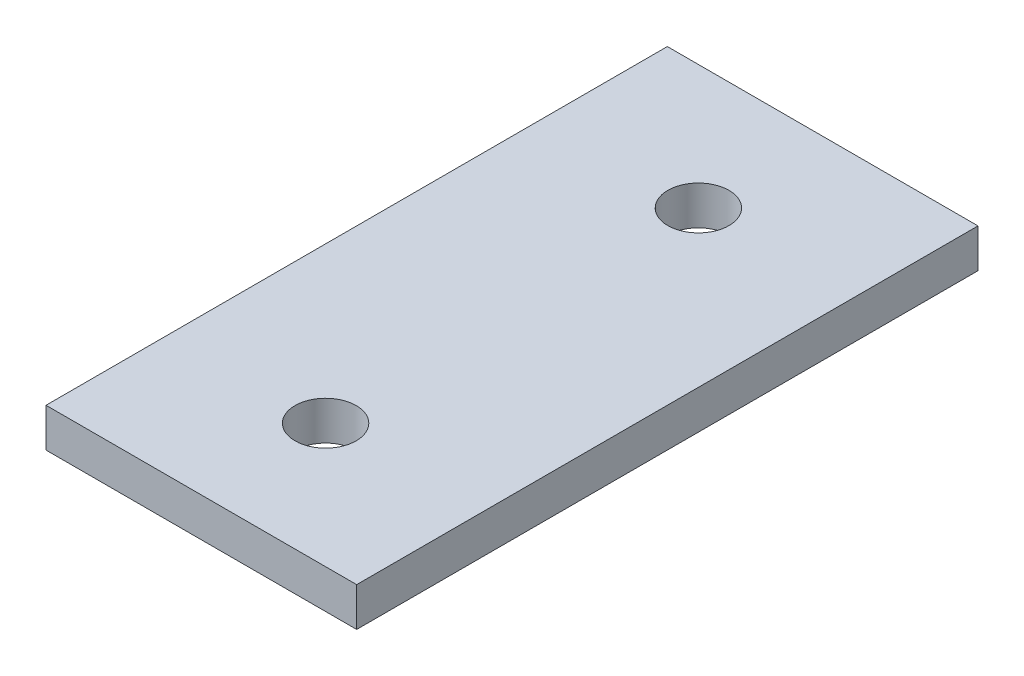
ISO-10303-21;
HEADER;
FILE_DESCRIPTION(('STEP AP214'),'2;1');
FILE_NAME('part.step','',(''),(''),'','','');
FILE_SCHEMA(('AUTOMOTIVE_DESIGN { 1 0 10303 214 1 1 1 1 }'));
ENDSEC;
DATA;
#1=APPLICATION_CONTEXT('core data for automotive mechanical design processes');
#2=APPLICATION_PROTOCOL_DEFINITION('international standard','automotive_design',2000,#1);
#3=PRODUCT_CONTEXT('',#1,'mechanical');
#4=PRODUCT('Part','Part','',(#3));
#5=PRODUCT_RELATED_PRODUCT_CATEGORY('part','',(#4));
#6=PRODUCT_DEFINITION_FORMATION('','',#4);
#7=PRODUCT_DEFINITION_CONTEXT('part definition',#1,'design');
#8=PRODUCT_DEFINITION('design','',#6,#7);
#9=PRODUCT_DEFINITION_SHAPE('','',#8);
#10=(LENGTH_UNIT() NAMED_UNIT(*) SI_UNIT(.MILLI.,.METRE.));
#11=(NAMED_UNIT(*) PLANE_ANGLE_UNIT() SI_UNIT($,.RADIAN.));
#12=(NAMED_UNIT(*) SI_UNIT($,.STERADIAN.) SOLID_ANGLE_UNIT());
#13=UNCERTAINTY_MEASURE_WITH_UNIT(LENGTH_MEASURE(1.E-05),#10,'distance_accuracy_value','');
#14=(GEOMETRIC_REPRESENTATION_CONTEXT(3) GLOBAL_UNCERTAINTY_ASSIGNED_CONTEXT((#13)) GLOBAL_UNIT_ASSIGNED_CONTEXT((#10,
#11,#12)) REPRESENTATION_CONTEXT('',''));
#15=CARTESIAN_POINT('',(0.,0.,0.));
#16=DIRECTION('',(0.,0.,1.));
#17=DIRECTION('',(1.,0.,0.));
#18=AXIS2_PLACEMENT_3D('',#15,#16,#17);
#19=CARTESIAN_POINT('',(12.7,1.5875,0.));
#20=DIRECTION('',(0.,0.,-1.));
#21=DIRECTION('',(-1.,0.,0.));
#22=AXIS2_PLACEMENT_3D('',#19,#20,#21);
#23=PLANE('',#22);
#24=DIRECTION('',(1.,0.,0.));
#25=VECTOR('',#24,1.);
#26=CARTESIAN_POINT('',(12.7,0.,0.));
#27=LINE('',#26,#25);
#28=CARTESIAN_POINT('',(0.,0.,0.));
#29=VERTEX_POINT('',#28);
#30=CARTESIAN_POINT('',(12.7,0.,0.));
#31=VERTEX_POINT('',#30);
#32=EDGE_CURVE('E100',#29,#31,#27,.T.);
#33=ORIENTED_EDGE('',*,*,#32,.T.);
#34=DIRECTION('',(0.,-1.,0.));
#35=VECTOR('',#34,1.);
#36=CARTESIAN_POINT('',(12.7,1.5875,0.));
#37=LINE('',#36,#35);
#38=CARTESIAN_POINT('',(12.7,1.5875,0.));
#39=VERTEX_POINT('',#38);
#40=EDGE_CURVE('E11',#39,#31,#37,.T.);
#41=ORIENTED_EDGE('',*,*,#40,.F.);
#42=DIRECTION('',(1.,0.,0.));
#43=VECTOR('',#42,1.);
#44=CARTESIAN_POINT('',(12.7,1.5875,0.));
#45=LINE('',#44,#43);
#46=CARTESIAN_POINT('',(0.,1.5875,0.));
#47=VERTEX_POINT('',#46);
#48=EDGE_CURVE('E88',#47,#39,#45,.T.);
#49=ORIENTED_EDGE('',*,*,#48,.F.);
#50=DIRECTION('',(0.,-1.,0.));
#51=VECTOR('',#50,1.);
#52=CARTESIAN_POINT('',(0.,1.5875,0.));
#53=LINE('',#52,#51);
#54=EDGE_CURVE('E96',#47,#29,#53,.T.);
#55=ORIENTED_EDGE('',*,*,#54,.T.);
#56=EDGE_LOOP('',(#33,#41,#49,#55));
#57=FACE_BOUND('',#56,.T.);
#58=ADVANCED_FACE('F37',(#57),#23,.F.);
#59=CARTESIAN_POINT('',(12.7,1.5875,-25.4));
#60=DIRECTION('',(-1.,0.,0.));
#61=DIRECTION('',(0.,0.,1.));
#62=AXIS2_PLACEMENT_3D('',#59,#60,#61);
#63=PLANE('',#62);
#64=DIRECTION('',(0.,0.,-1.));
#65=VECTOR('',#64,1.);
#66=CARTESIAN_POINT('',(12.7,0.,-25.4));
#67=LINE('',#66,#65);
#68=CARTESIAN_POINT('',(12.7,0.,-25.4));
#69=VERTEX_POINT('',#68);
#70=EDGE_CURVE('E92',#31,#69,#67,.T.);
#71=ORIENTED_EDGE('',*,*,#70,.T.);
#72=DIRECTION('',(0.,-1.,0.));
#73=VECTOR('',#72,1.);
#74=CARTESIAN_POINT('',(12.7,1.5875,-25.4));
#75=LINE('',#74,#73);
#76=CARTESIAN_POINT('',(12.7,1.5875,-25.4));
#77=VERTEX_POINT('',#76);
#78=EDGE_CURVE('E45',#77,#69,#75,.T.);
#79=ORIENTED_EDGE('',*,*,#78,.F.);
#80=DIRECTION('',(0.,0.,-1.));
#81=VECTOR('',#80,1.);
#82=CARTESIAN_POINT('',(12.7,1.5875,-25.4));
#83=LINE('',#82,#81);
#84=EDGE_CURVE('E83',#39,#77,#83,.T.);
#85=ORIENTED_EDGE('',*,*,#84,.F.);
#86=ORIENTED_EDGE('',*,*,#40,.T.);
#87=EDGE_LOOP('',(#71,#79,#85,#86));
#88=FACE_BOUND('',#87,.T.);
#89=ADVANCED_FACE('F91',(#88),#63,.F.);
#90=CARTESIAN_POINT('',(0.,1.5875,-25.4));
#91=DIRECTION('',(0.,0.,1.));
#92=DIRECTION('',(1.,0.,0.));
#93=AXIS2_PLACEMENT_3D('',#90,#91,#92);
#94=PLANE('',#93);
#95=DIRECTION('',(-1.,0.,0.));
#96=VECTOR('',#95,1.);
#97=CARTESIAN_POINT('',(0.,0.,-25.4));
#98=LINE('',#97,#96);
#99=CARTESIAN_POINT('',(0.,0.,-25.4));
#100=VERTEX_POINT('',#99);
#101=EDGE_CURVE('E70',#69,#100,#98,.T.);
#102=ORIENTED_EDGE('',*,*,#101,.T.);
#103=DIRECTION('',(0.,-1.,0.));
#104=VECTOR('',#103,1.);
#105=CARTESIAN_POINT('',(0.,1.5875,-25.4));
#106=LINE('',#105,#104);
#107=CARTESIAN_POINT('',(0.,1.5875,-25.4));
#108=VERTEX_POINT('',#107);
#109=EDGE_CURVE('E93',#108,#100,#106,.T.);
#110=ORIENTED_EDGE('',*,*,#109,.F.);
#111=DIRECTION('',(-1.,0.,0.));
#112=VECTOR('',#111,1.);
#113=CARTESIAN_POINT('',(0.,1.5875,-25.4));
#114=LINE('',#113,#112);
#115=EDGE_CURVE('E86',#77,#108,#114,.T.);
#116=ORIENTED_EDGE('',*,*,#115,.F.);
#117=ORIENTED_EDGE('',*,*,#78,.T.);
#118=EDGE_LOOP('',(#102,#110,#116,#117));
#119=FACE_BOUND('',#118,.T.);
#120=ADVANCED_FACE('F94',(#119),#94,.F.);
#121=CARTESIAN_POINT('',(0.,1.5875,0.));
#122=DIRECTION('',(1.,0.,0.));
#123=DIRECTION('',(0.,0.,-1.));
#124=AXIS2_PLACEMENT_3D('',#121,#122,#123);
#125=PLANE('',#124);
#126=DIRECTION('',(0.,0.,1.));
#127=VECTOR('',#126,1.);
#128=CARTESIAN_POINT('',(0.,0.,0.));
#129=LINE('',#128,#127);
#130=EDGE_CURVE('E76',#100,#29,#129,.T.);
#131=ORIENTED_EDGE('',*,*,#130,.T.);
#132=ORIENTED_EDGE('',*,*,#54,.F.);
#133=DIRECTION('',(0.,0.,1.));
#134=VECTOR('',#133,1.);
#135=CARTESIAN_POINT('',(0.,1.5875,0.));
#136=LINE('',#135,#134);
#137=EDGE_CURVE('E53',#108,#47,#136,.T.);
#138=ORIENTED_EDGE('',*,*,#137,.F.);
#139=ORIENTED_EDGE('',*,*,#109,.T.);
#140=EDGE_LOOP('',(#131,#132,#138,#139));
#141=FACE_BOUND('',#140,.T.);
#142=ADVANCED_FACE('F108',(#141),#125,.F.);
#143=CARTESIAN_POINT('',(0.,1.5875,0.));
#144=DIRECTION('',(0.,-1.,0.));
#145=DIRECTION('',(0.,0.,-1.));
#146=AXIS2_PLACEMENT_3D('',#143,#144,#145);
#147=PLANE('',#146);
#148=CARTESIAN_POINT('',(6.35,1.5875,-20.32));
#149=DIRECTION('',(0.,1.,0.));
#150=DIRECTION('',(0.,0.,1.));
#151=AXIS2_PLACEMENT_3D('',#148,#149,#150);
#152=CIRCLE('',#151,1.25);
#153=CARTESIAN_POINT('',(6.35,1.5875,-19.07));
#154=VERTEX_POINT('',#153);
#155=EDGE_CURVE('E122',#154,#154,#152,.T.);
#156=ORIENTED_EDGE('',*,*,#155,.F.);
#157=EDGE_LOOP('',(#156));
#158=FACE_BOUND('',#157,.T.);
#159=CARTESIAN_POINT('',(6.35,1.5875,-5.08));
#160=DIRECTION('',(0.,1.,0.));
#161=DIRECTION('',(0.,0.,1.));
#162=AXIS2_PLACEMENT_3D('',#159,#160,#161);
#163=CIRCLE('',#162,1.25);
#164=CARTESIAN_POINT('',(6.35,1.5875,-3.83));
#165=VERTEX_POINT('',#164);
#166=EDGE_CURVE('E116',#165,#165,#163,.T.);
#167=ORIENTED_EDGE('',*,*,#166,.F.);
#168=EDGE_LOOP('',(#167));
#169=FACE_BOUND('',#168,.T.);
#170=ORIENTED_EDGE('',*,*,#48,.T.);
#171=ORIENTED_EDGE('',*,*,#84,.T.);
#172=ORIENTED_EDGE('',*,*,#115,.T.);
#173=ORIENTED_EDGE('',*,*,#137,.T.);
#174=EDGE_LOOP('',(#170,#171,#172,#173));
#175=FACE_BOUND('',#174,.T.);
#176=ADVANCED_FACE('F84',(#158,#169,#175),#147,.F.);
#177=CARTESIAN_POINT('',(0.,0.,0.));
#178=DIRECTION('',(0.,-1.,0.));
#179=DIRECTION('',(0.,0.,-1.));
#180=AXIS2_PLACEMENT_3D('',#177,#178,#179);
#181=PLANE('',#180);
#182=CARTESIAN_POINT('',(6.35,0.,-20.32));
#183=DIRECTION('',(0.,1.,0.));
#184=DIRECTION('',(0.,0.,1.));
#185=AXIS2_PLACEMENT_3D('',#182,#183,#184);
#186=CIRCLE('',#185,1.25);
#187=CARTESIAN_POINT('',(6.35,0.,-19.07));
#188=VERTEX_POINT('',#187);
#189=EDGE_CURVE('E119',#188,#188,#186,.T.);
#190=ORIENTED_EDGE('',*,*,#189,.T.);
#191=EDGE_LOOP('',(#190));
#192=FACE_BOUND('',#191,.T.);
#193=CARTESIAN_POINT('',(6.35,0.,-5.08));
#194=DIRECTION('',(0.,1.,0.));
#195=DIRECTION('',(0.,0.,1.));
#196=AXIS2_PLACEMENT_3D('',#193,#194,#195);
#197=CIRCLE('',#196,1.25);
#198=CARTESIAN_POINT('',(6.35,0.,-3.83));
#199=VERTEX_POINT('',#198);
#200=EDGE_CURVE('E103',#199,#199,#197,.T.);
#201=ORIENTED_EDGE('',*,*,#200,.T.);
#202=EDGE_LOOP('',(#201));
#203=FACE_BOUND('',#202,.T.);
#204=ORIENTED_EDGE('',*,*,#32,.F.);
#205=ORIENTED_EDGE('',*,*,#130,.F.);
#206=ORIENTED_EDGE('',*,*,#101,.F.);
#207=ORIENTED_EDGE('',*,*,#70,.F.);
#208=EDGE_LOOP('',(#204,#205,#206,#207));
#209=FACE_BOUND('',#208,.T.);
#210=ADVANCED_FACE('F111',(#192,#203,#209),#181,.T.);
#211=CARTESIAN_POINT('',(6.35,1.5875,-5.08));
#212=DIRECTION('',(0.,1.,0.));
#213=DIRECTION('',(0.,0.,1.));
#214=AXIS2_PLACEMENT_3D('',#211,#212,#213);
#215=CYLINDRICAL_SURFACE('',#214,1.25);
#216=ORIENTED_EDGE('',*,*,#200,.F.);
#217=EDGE_LOOP('',(#216));
#218=FACE_BOUND('',#217,.T.);
#219=ORIENTED_EDGE('',*,*,#166,.T.);
#220=EDGE_LOOP('',(#219));
#221=FACE_BOUND('',#220,.T.);
#222=ADVANCED_FACE('F133',(#218,#221),#215,.F.);
#223=CARTESIAN_POINT('',(6.35,1.5875,-20.32));
#224=DIRECTION('',(0.,1.,0.));
#225=DIRECTION('',(0.,0.,1.));
#226=AXIS2_PLACEMENT_3D('',#223,#224,#225);
#227=CYLINDRICAL_SURFACE('',#226,1.25);
#228=ORIENTED_EDGE('',*,*,#189,.F.);
#229=EDGE_LOOP('',(#228));
#230=FACE_BOUND('',#229,.T.);
#231=ORIENTED_EDGE('',*,*,#155,.T.);
#232=EDGE_LOOP('',(#231));
#233=FACE_BOUND('',#232,.T.);
#234=ADVANCED_FACE('F126',(#230,#233),#227,.F.);
#235=CLOSED_SHELL('',(#58,#89,#120,#142,#176,#210,#222,#234));
#236=MANIFOLD_SOLID_BREP('B2',#235);
#237=ADVANCED_BREP_SHAPE_REPRESENTATION('',(#18,#236),#14);
#238=SHAPE_DEFINITION_REPRESENTATION(#9,#237);
ENDSEC;
END-ISO-10303-21;
